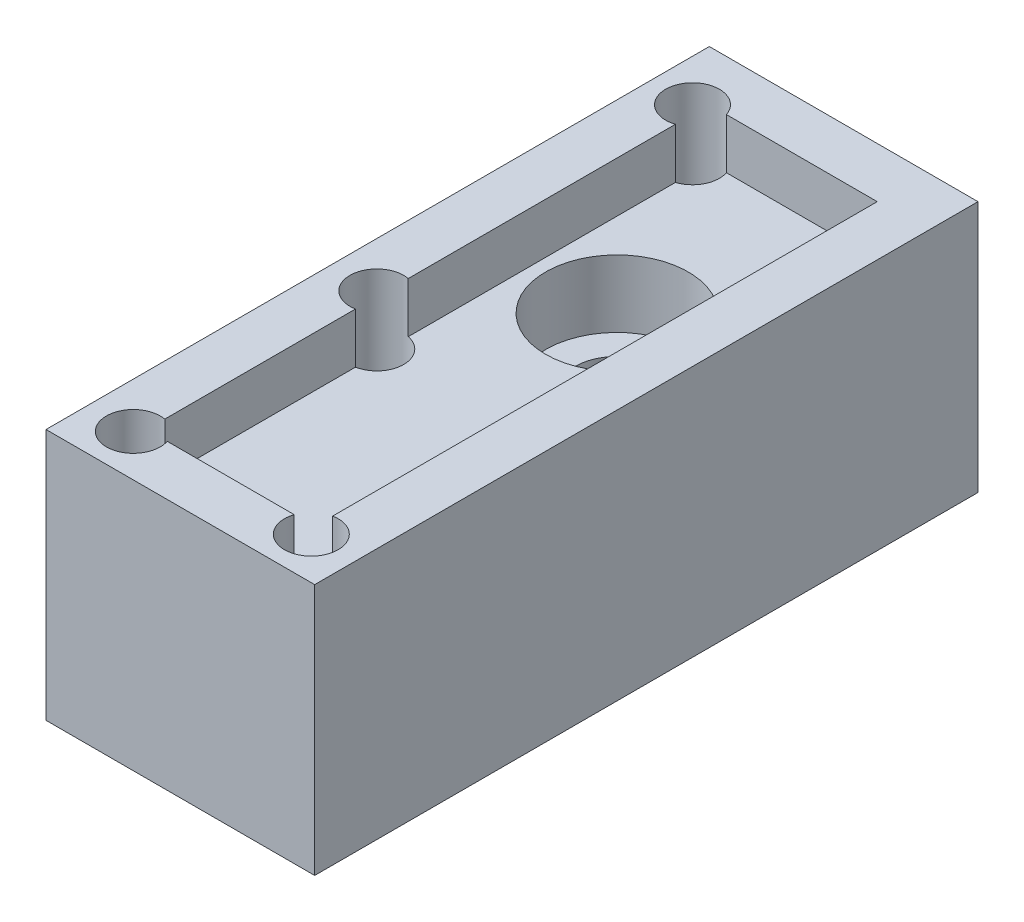
ISO-10303-21;
HEADER;
FILE_DESCRIPTION(('STEP AP214'),'2;1');
FILE_NAME('part.step','',(''),(''),'','','');
FILE_SCHEMA(('AUTOMOTIVE_DESIGN { 1 0 10303 214 1 1 1 1 }'));
ENDSEC;
DATA;
#1=APPLICATION_CONTEXT('core data for automotive mechanical design processes');
#2=APPLICATION_PROTOCOL_DEFINITION('international standard','automotive_design',2000,#1);
#3=PRODUCT_CONTEXT('',#1,'mechanical');
#4=PRODUCT('Part','Part','',(#3));
#5=PRODUCT_RELATED_PRODUCT_CATEGORY('part','',(#4));
#6=PRODUCT_DEFINITION_FORMATION('','',#4);
#7=PRODUCT_DEFINITION_CONTEXT('part definition',#1,'design');
#8=PRODUCT_DEFINITION('design','',#6,#7);
#9=PRODUCT_DEFINITION_SHAPE('','',#8);
#10=(LENGTH_UNIT() NAMED_UNIT(*) SI_UNIT(.MILLI.,.METRE.));
#11=(NAMED_UNIT(*) PLANE_ANGLE_UNIT() SI_UNIT($,.RADIAN.));
#12=(NAMED_UNIT(*) SI_UNIT($,.STERADIAN.) SOLID_ANGLE_UNIT());
#13=UNCERTAINTY_MEASURE_WITH_UNIT(LENGTH_MEASURE(1.E-05),#10,'distance_accuracy_value','');
#14=(GEOMETRIC_REPRESENTATION_CONTEXT(3) GLOBAL_UNCERTAINTY_ASSIGNED_CONTEXT((#13)) GLOBAL_UNIT_ASSIGNED_CONTEXT((#10,
#11,#12)) REPRESENTATION_CONTEXT('',''));
#15=CARTESIAN_POINT('',(0.,0.,0.));
#16=DIRECTION('',(0.,0.,1.));
#17=DIRECTION('',(1.,0.,0.));
#18=AXIS2_PLACEMENT_3D('',#15,#16,#17);
#19=CARTESIAN_POINT('',(8.,-8.,-26.));
#20=DIRECTION('',(0.,1.,0.));
#21=DIRECTION('',(0.,0.,1.));
#22=AXIS2_PLACEMENT_3D('',#19,#20,#21);
#23=CYLINDRICAL_SURFACE('',#22,2.5);
#24=CARTESIAN_POINT('',(8.,0.,-26.));
#25=DIRECTION('',(0.,-1.,0.));
#26=DIRECTION('',(0.,0.,-1.));
#27=AXIS2_PLACEMENT_3D('',#24,#25,#26);
#28=CIRCLE('',#27,2.5);
#29=CARTESIAN_POINT('',(8.,0.,-28.5));
#30=VERTEX_POINT('',#29);
#31=EDGE_CURVE('E243',#30,#30,#28,.T.);
#32=ORIENTED_EDGE('',*,*,#31,.T.);
#33=EDGE_LOOP('',(#32));
#34=FACE_BOUND('',#33,.T.);
#35=CARTESIAN_POINT('',(8.,8.,-26.));
#36=DIRECTION('',(0.,1.,0.));
#37=DIRECTION('',(0.,0.,1.));
#38=AXIS2_PLACEMENT_3D('',#35,#36,#37);
#39=CIRCLE('',#38,2.5);
#40=CARTESIAN_POINT('',(8.,8.,-23.5));
#41=VERTEX_POINT('',#40);
#42=EDGE_CURVE('E37',#41,#41,#39,.F.);
#43=ORIENTED_EDGE('',*,*,#42,.F.);
#44=EDGE_LOOP('',(#43));
#45=FACE_BOUND('',#44,.T.);
#46=ADVANCED_FACE('F33',(#34,#45),#23,.F.);
#47=CARTESIAN_POINT('',(3.,12.,-3.));
#48=DIRECTION('',(-1.,0.,0.));
#49=DIRECTION('',(0.,0.,1.));
#50=AXIS2_PLACEMENT_3D('',#47,#48,#49);
#51=PLANE('',#50);
#52=DIRECTION('',(0.,-1.,0.));
#53=VECTOR('',#52,1.);
#54=CARTESIAN_POINT('',(3.,18.,-18.5716233645502));
#55=LINE('',#54,#53);
#56=CARTESIAN_POINT('',(3.,12.,-18.5716233645502));
#57=VERTEX_POINT('',#56);
#58=CARTESIAN_POINT('',(3.,15.,-18.5716233645502));
#59=VERTEX_POINT('',#58);
#60=EDGE_CURVE('E206',#57,#59,#55,.F.);
#61=ORIENTED_EDGE('',*,*,#60,.F.);
#62=DIRECTION('',(0.,0.,1.));
#63=VECTOR('',#62,1.);
#64=CARTESIAN_POINT('',(3.,12.,-3.));
#65=LINE('',#64,#63);
#66=CARTESIAN_POINT('',(3.,12.,-34.4801315846429));
#67=VERTEX_POINT('',#66);
#68=EDGE_CURVE('E212',#67,#57,#65,.T.);
#69=ORIENTED_EDGE('',*,*,#68,.F.);
#70=DIRECTION('',(0.,-1.,0.));
#71=VECTOR('',#70,1.);
#72=CARTESIAN_POINT('',(3.,18.,-34.4801315846429));
#73=LINE('',#72,#71);
#74=CARTESIAN_POINT('',(3.,15.,-34.4801315846429));
#75=VERTEX_POINT('',#74);
#76=EDGE_CURVE('E133',#75,#67,#73,.T.);
#77=ORIENTED_EDGE('',*,*,#76,.F.);
#78=DIRECTION('',(0.,0.,1.));
#79=VECTOR('',#78,1.);
#80=CARTESIAN_POINT('',(3.,15.,-3.));
#81=LINE('',#80,#79);
#82=EDGE_CURVE('E164',#75,#59,#81,.T.);
#83=ORIENTED_EDGE('',*,*,#82,.T.);
#84=EDGE_LOOP('',(#61,#69,#77,#83));
#85=FACE_BOUND('',#84,.T.);
#86=ADVANCED_FACE('F211',(#85),#51,.F.);
#87=DIRECTION('',(0.,-1.,0.));
#88=VECTOR('',#87,1.);
#89=CARTESIAN_POINT('',(3.,18.,-15.4283766354498));
#90=LINE('',#89,#88);
#91=CARTESIAN_POINT('',(3.,15.,-15.4283766354498));
#92=VERTEX_POINT('',#91);
#93=CARTESIAN_POINT('',(3.,12.,-15.4283766354498));
#94=VERTEX_POINT('',#93);
#95=EDGE_CURVE('E56',#92,#94,#90,.T.);
#96=ORIENTED_EDGE('',*,*,#95,.F.);
#97=CARTESIAN_POINT('',(3.,15.,-4.07162336455017));
#98=VERTEX_POINT('',#97);
#99=EDGE_CURVE('E162',#92,#98,#81,.T.);
#100=ORIENTED_EDGE('',*,*,#99,.T.);
#101=DIRECTION('',(0.,1.,0.));
#102=VECTOR('',#101,1.);
#103=CARTESIAN_POINT('',(3.,0.,-4.07162336455017));
#104=LINE('',#103,#102);
#105=CARTESIAN_POINT('',(3.,12.,-4.07162336455017));
#106=VERTEX_POINT('',#105);
#107=EDGE_CURVE('E165',#98,#106,#104,.F.);
#108=ORIENTED_EDGE('',*,*,#107,.T.);
#109=EDGE_CURVE('E171',#94,#106,#65,.T.);
#110=ORIENTED_EDGE('',*,*,#109,.F.);
#111=EDGE_LOOP('',(#96,#100,#108,#110));
#112=FACE_BOUND('',#111,.T.);
#113=ADVANCED_FACE('F270',(#112),#51,.F.);
#114=CARTESIAN_POINT('',(3.,12.,-36.5));
#115=DIRECTION('',(0.,0.,-1.));
#116=DIRECTION('',(-1.,0.,0.));
#117=AXIS2_PLACEMENT_3D('',#114,#115,#116);
#118=PLANE('',#117);
#119=DIRECTION('',(0.,-1.,0.));
#120=VECTOR('',#119,1.);
#121=CARTESIAN_POINT('',(4.01986841535706,18.,-36.5));
#122=LINE('',#121,#120);
#123=CARTESIAN_POINT('',(4.01986841535706,12.,-36.5));
#124=VERTEX_POINT('',#123);
#125=CARTESIAN_POINT('',(4.01986841535706,15.,-36.5));
#126=VERTEX_POINT('',#125);
#127=EDGE_CURVE('E130',#124,#126,#122,.F.);
#128=ORIENTED_EDGE('',*,*,#127,.F.);
#129=DIRECTION('',(-1.,0.,0.));
#130=VECTOR('',#129,1.);
#131=CARTESIAN_POINT('',(3.,12.,-36.5));
#132=LINE('',#131,#130);
#133=CARTESIAN_POINT('',(13.,12.,-36.5));
#134=VERTEX_POINT('',#133);
#135=EDGE_CURVE('E145',#134,#124,#132,.T.);
#136=ORIENTED_EDGE('',*,*,#135,.F.);
#137=DIRECTION('',(0.,1.,0.));
#138=VECTOR('',#137,1.);
#139=CARTESIAN_POINT('',(13.,12.,-36.5));
#140=LINE('',#139,#138);
#141=CARTESIAN_POINT('',(13.,15.,-36.5));
#142=VERTEX_POINT('',#141);
#143=EDGE_CURVE('E154',#134,#142,#140,.T.);
#144=ORIENTED_EDGE('',*,*,#143,.T.);
#145=DIRECTION('',(-1.,0.,0.));
#146=VECTOR('',#145,1.);
#147=CARTESIAN_POINT('',(3.,15.,-36.5));
#148=LINE('',#147,#146);
#149=EDGE_CURVE('E147',#142,#126,#148,.T.);
#150=ORIENTED_EDGE('',*,*,#149,.T.);
#151=EDGE_LOOP('',(#128,#136,#144,#150));
#152=FACE_BOUND('',#151,.T.);
#153=ADVANCED_FACE('F143',(#152),#118,.F.);
#154=CARTESIAN_POINT('',(13.,12.,-3.));
#155=DIRECTION('',(1.,0.,0.));
#156=DIRECTION('',(0.,0.,-1.));
#157=AXIS2_PLACEMENT_3D('',#154,#155,#156);
#158=PLANE('',#157);
#159=DIRECTION('',(0.,-1.,0.));
#160=VECTOR('',#159,1.);
#161=CARTESIAN_POINT('',(13.,18.,-4.07162336455017));
#162=LINE('',#161,#160);
#163=CARTESIAN_POINT('',(13.,15.,-4.07162336455017));
#164=VERTEX_POINT('',#163);
#165=CARTESIAN_POINT('',(13.,12.,-4.07162336455017));
#166=VERTEX_POINT('',#165);
#167=EDGE_CURVE('E48',#164,#166,#162,.T.);
#168=ORIENTED_EDGE('',*,*,#167,.F.);
#169=DIRECTION('',(0.,0.,-1.));
#170=VECTOR('',#169,1.);
#171=CARTESIAN_POINT('',(13.,15.,-3.));
#172=LINE('',#171,#170);
#173=EDGE_CURVE('E169',#164,#142,#172,.T.);
#174=ORIENTED_EDGE('',*,*,#173,.T.);
#175=ORIENTED_EDGE('',*,*,#143,.F.);
#176=DIRECTION('',(0.,0.,-1.));
#177=VECTOR('',#176,1.);
#178=CARTESIAN_POINT('',(13.,12.,-3.));
#179=LINE('',#178,#177);
#180=EDGE_CURVE('E152',#166,#134,#179,.T.);
#181=ORIENTED_EDGE('',*,*,#180,.F.);
#182=EDGE_LOOP('',(#168,#174,#175,#181));
#183=FACE_BOUND('',#182,.T.);
#184=ADVANCED_FACE('F295',(#183),#158,.F.);
#185=CARTESIAN_POINT('',(3.,12.,-3.));
#186=DIRECTION('',(0.,0.,1.));
#187=DIRECTION('',(1.,0.,0.));
#188=AXIS2_PLACEMENT_3D('',#185,#186,#187);
#189=PLANE('',#188);
#190=DIRECTION('',(0.,-1.,0.));
#191=VECTOR('',#190,1.);
#192=CARTESIAN_POINT('',(11.7801315846429,18.,-3.));
#193=LINE('',#192,#191);
#194=CARTESIAN_POINT('',(11.7801315846429,12.,-3.));
#195=VERTEX_POINT('',#194);
#196=CARTESIAN_POINT('',(11.7801315846429,15.,-3.));
#197=VERTEX_POINT('',#196);
#198=EDGE_CURVE('E232',#195,#197,#193,.F.);
#199=ORIENTED_EDGE('',*,*,#198,.F.);
#200=DIRECTION('',(1.,0.,0.));
#201=VECTOR('',#200,1.);
#202=CARTESIAN_POINT('',(3.,12.,-3.));
#203=LINE('',#202,#201);
#204=CARTESIAN_POINT('',(4.21986841535707,12.,-3.));
#205=VERTEX_POINT('',#204);
#206=EDGE_CURVE('E158',#205,#195,#203,.T.);
#207=ORIENTED_EDGE('',*,*,#206,.F.);
#208=DIRECTION('',(0.,1.,0.));
#209=VECTOR('',#208,1.);
#210=CARTESIAN_POINT('',(4.21986841535707,0.,-3.));
#211=LINE('',#210,#209);
#212=CARTESIAN_POINT('',(4.21986841535707,15.,-3.));
#213=VERTEX_POINT('',#212);
#214=EDGE_CURVE('E221',#205,#213,#211,.T.);
#215=ORIENTED_EDGE('',*,*,#214,.T.);
#216=DIRECTION('',(1.,0.,0.));
#217=VECTOR('',#216,1.);
#218=CARTESIAN_POINT('',(3.,15.,-3.));
#219=LINE('',#218,#217);
#220=EDGE_CURVE('E166',#213,#197,#219,.T.);
#221=ORIENTED_EDGE('',*,*,#220,.T.);
#222=EDGE_LOOP('',(#199,#207,#215,#221));
#223=FACE_BOUND('',#222,.T.);
#224=ADVANCED_FACE('F298',(#223),#189,.F.);
#225=CARTESIAN_POINT('',(0.,15.,0.));
#226=DIRECTION('',(1.,0.,0.));
#227=DIRECTION('',(0.,0.,-1.));
#228=AXIS2_PLACEMENT_3D('',#225,#226,#227);
#229=PLANE('',#228);
#230=DIRECTION('',(0.,0.,1.));
#231=VECTOR('',#230,1.);
#232=CARTESIAN_POINT('',(0.,0.,0.));
#233=LINE('',#232,#231);
#234=CARTESIAN_POINT('',(0.,0.,-39.5));
#235=VERTEX_POINT('',#234);
#236=CARTESIAN_POINT('',(0.,0.,0.));
#237=VERTEX_POINT('',#236);
#238=EDGE_CURVE('E156',#235,#237,#233,.T.);
#239=ORIENTED_EDGE('',*,*,#238,.T.);
#240=DIRECTION('',(0.,-1.,0.));
#241=VECTOR('',#240,1.);
#242=CARTESIAN_POINT('',(0.,15.,0.));
#243=LINE('',#242,#241);
#244=CARTESIAN_POINT('',(0.,15.,0.));
#245=VERTEX_POINT('',#244);
#246=EDGE_CURVE('E199',#245,#237,#243,.T.);
#247=ORIENTED_EDGE('',*,*,#246,.F.);
#248=DIRECTION('',(0.,0.,1.));
#249=VECTOR('',#248,1.);
#250=CARTESIAN_POINT('',(0.,15.,0.));
#251=LINE('',#250,#249);
#252=CARTESIAN_POINT('',(0.,15.,-39.5));
#253=VERTEX_POINT('',#252);
#254=EDGE_CURVE('E173',#253,#245,#251,.T.);
#255=ORIENTED_EDGE('',*,*,#254,.F.);
#256=DIRECTION('',(0.,-1.,0.));
#257=VECTOR('',#256,1.);
#258=CARTESIAN_POINT('',(0.,15.,-39.5));
#259=LINE('',#258,#257);
#260=EDGE_CURVE('E183',#253,#235,#259,.T.);
#261=ORIENTED_EDGE('',*,*,#260,.T.);
#262=EDGE_LOOP('',(#239,#247,#255,#261));
#263=FACE_BOUND('',#262,.T.);
#264=ADVANCED_FACE('F35',(#263),#229,.F.);
#265=CARTESIAN_POINT('',(0.,15.,0.));
#266=DIRECTION('',(0.,0.,-1.));
#267=DIRECTION('',(-1.,0.,0.));
#268=AXIS2_PLACEMENT_3D('',#265,#266,#267);
#269=PLANE('',#268);
#270=DIRECTION('',(1.,0.,0.));
#271=VECTOR('',#270,1.);
#272=CARTESIAN_POINT('',(0.,0.,0.));
#273=LINE('',#272,#271);
#274=CARTESIAN_POINT('',(16.,0.,0.));
#275=VERTEX_POINT('',#274);
#276=EDGE_CURVE('E186',#237,#275,#273,.T.);
#277=ORIENTED_EDGE('',*,*,#276,.T.);
#278=DIRECTION('',(0.,-1.,0.));
#279=VECTOR('',#278,1.);
#280=CARTESIAN_POINT('',(16.,15.,0.));
#281=LINE('',#280,#279);
#282=CARTESIAN_POINT('',(16.,15.,0.));
#283=VERTEX_POINT('',#282);
#284=EDGE_CURVE('E196',#283,#275,#281,.T.);
#285=ORIENTED_EDGE('',*,*,#284,.F.);
#286=DIRECTION('',(1.,0.,0.));
#287=VECTOR('',#286,1.);
#288=CARTESIAN_POINT('',(0.,15.,0.));
#289=LINE('',#288,#287);
#290=EDGE_CURVE('E176',#245,#283,#289,.T.);
#291=ORIENTED_EDGE('',*,*,#290,.F.);
#292=ORIENTED_EDGE('',*,*,#246,.T.);
#293=EDGE_LOOP('',(#277,#285,#291,#292));
#294=FACE_BOUND('',#293,.T.);
#295=ADVANCED_FACE('F316',(#294),#269,.F.);
#296=CARTESIAN_POINT('',(16.,15.,0.));
#297=DIRECTION('',(-1.,0.,0.));
#298=DIRECTION('',(0.,0.,1.));
#299=AXIS2_PLACEMENT_3D('',#296,#297,#298);
#300=PLANE('',#299);
#301=DIRECTION('',(0.,0.,-1.));
#302=VECTOR('',#301,1.);
#303=CARTESIAN_POINT('',(16.,0.,0.));
#304=LINE('',#303,#302);
#305=CARTESIAN_POINT('',(16.,0.,-39.5));
#306=VERTEX_POINT('',#305);
#307=EDGE_CURVE('E188',#275,#306,#304,.T.);
#308=ORIENTED_EDGE('',*,*,#307,.T.);
#309=DIRECTION('',(0.,-1.,0.));
#310=VECTOR('',#309,1.);
#311=CARTESIAN_POINT('',(16.,15.,-39.5));
#312=LINE('',#311,#310);
#313=CARTESIAN_POINT('',(16.,15.,-39.5));
#314=VERTEX_POINT('',#313);
#315=EDGE_CURVE('E193',#314,#306,#312,.T.);
#316=ORIENTED_EDGE('',*,*,#315,.F.);
#317=DIRECTION('',(0.,0.,-1.));
#318=VECTOR('',#317,1.);
#319=CARTESIAN_POINT('',(16.,15.,0.));
#320=LINE('',#319,#318);
#321=EDGE_CURVE('E179',#283,#314,#320,.T.);
#322=ORIENTED_EDGE('',*,*,#321,.F.);
#323=ORIENTED_EDGE('',*,*,#284,.T.);
#324=EDGE_LOOP('',(#308,#316,#322,#323));
#325=FACE_BOUND('',#324,.T.);
#326=ADVANCED_FACE('F313',(#325),#300,.F.);
#327=CARTESIAN_POINT('',(0.,15.,-39.5));
#328=DIRECTION('',(0.,0.,1.));
#329=DIRECTION('',(1.,0.,0.));
#330=AXIS2_PLACEMENT_3D('',#327,#328,#329);
#331=PLANE('',#330);
#332=DIRECTION('',(-1.,0.,0.));
#333=VECTOR('',#332,1.);
#334=CARTESIAN_POINT('',(0.,0.,-39.5));
#335=LINE('',#334,#333);
#336=EDGE_CURVE('E177',#306,#235,#335,.T.);
#337=ORIENTED_EDGE('',*,*,#336,.T.);
#338=ORIENTED_EDGE('',*,*,#260,.F.);
#339=DIRECTION('',(-1.,0.,0.));
#340=VECTOR('',#339,1.);
#341=CARTESIAN_POINT('',(0.,15.,-39.5));
#342=LINE('',#341,#340);
#343=EDGE_CURVE('E181',#314,#253,#342,.T.);
#344=ORIENTED_EDGE('',*,*,#343,.F.);
#345=ORIENTED_EDGE('',*,*,#315,.T.);
#346=EDGE_LOOP('',(#337,#338,#344,#345));
#347=FACE_BOUND('',#346,.T.);
#348=ADVANCED_FACE('F306',(#347),#331,.F.);
#349=CARTESIAN_POINT('',(0.,15.,0.));
#350=DIRECTION('',(0.,-1.,0.));
#351=DIRECTION('',(0.,0.,-1.));
#352=AXIS2_PLACEMENT_3D('',#349,#350,#351);
#353=PLANE('',#352);
#354=CARTESIAN_POINT('',(13.3,15.,-2.5));
#355=DIRECTION('',(0.,-1.,0.));
#356=DIRECTION('',(0.,0.,-1.));
#357=AXIS2_PLACEMENT_3D('',#354,#355,#356);
#358=CIRCLE('',#357,1.6);
#359=EDGE_CURVE('E229',#197,#164,#358,.F.);
#360=ORIENTED_EDGE('',*,*,#359,.F.);
#361=ORIENTED_EDGE('',*,*,#220,.F.);
#362=CARTESIAN_POINT('',(2.7,15.,-2.5));
#363=DIRECTION('',(0.,1.,0.));
#364=DIRECTION('',(0.,0.,1.));
#365=AXIS2_PLACEMENT_3D('',#362,#363,#364);
#366=CIRCLE('',#365,1.6);
#367=EDGE_CURVE('E227',#98,#213,#366,.T.);
#368=ORIENTED_EDGE('',*,*,#367,.F.);
#369=ORIENTED_EDGE('',*,*,#99,.F.);
#370=CARTESIAN_POINT('',(2.7,15.,-17.));
#371=DIRECTION('',(0.,-1.,0.));
#372=DIRECTION('',(0.,0.,-1.));
#373=AXIS2_PLACEMENT_3D('',#370,#371,#372);
#374=CIRCLE('',#373,1.6);
#375=EDGE_CURVE('E214',#59,#92,#374,.F.);
#376=ORIENTED_EDGE('',*,*,#375,.F.);
#377=ORIENTED_EDGE('',*,*,#82,.F.);
#378=CARTESIAN_POINT('',(2.5,15.,-36.));
#379=DIRECTION('',(0.,-1.,0.));
#380=DIRECTION('',(0.,0.,-1.));
#381=AXIS2_PLACEMENT_3D('',#378,#379,#380);
#382=CIRCLE('',#381,1.6);
#383=EDGE_CURVE('E236',#126,#75,#382,.F.);
#384=ORIENTED_EDGE('',*,*,#383,.F.);
#385=ORIENTED_EDGE('',*,*,#149,.F.);
#386=ORIENTED_EDGE('',*,*,#173,.F.);
#387=EDGE_LOOP('',(#360,#361,#368,#369,#376,#377,#384,#385,#386));
#388=FACE_BOUND('',#387,.T.);
#389=ORIENTED_EDGE('',*,*,#254,.T.);
#390=ORIENTED_EDGE('',*,*,#290,.T.);
#391=ORIENTED_EDGE('',*,*,#321,.T.);
#392=ORIENTED_EDGE('',*,*,#343,.T.);
#393=EDGE_LOOP('',(#389,#390,#391,#392));
#394=FACE_BOUND('',#393,.T.);
#395=ADVANCED_FACE('F303',(#388,#394),#353,.F.);
#396=CARTESIAN_POINT('',(0.,0.,0.));
#397=DIRECTION('',(0.,-1.,0.));
#398=DIRECTION('',(0.,0.,-1.));
#399=AXIS2_PLACEMENT_3D('',#396,#397,#398);
#400=PLANE('',#399);
#401=ORIENTED_EDGE('',*,*,#31,.F.);
#402=EDGE_LOOP('',(#401));
#403=FACE_BOUND('',#402,.T.);
#404=CARTESIAN_POINT('',(13.3,0.,-2.5));
#405=DIRECTION('',(0.,1.,0.));
#406=DIRECTION('',(0.,0.,1.));
#407=AXIS2_PLACEMENT_3D('',#404,#405,#406);
#408=CIRCLE('',#407,1.6);
#409=CARTESIAN_POINT('',(13.3,0.,-0.899999999999998));
#410=VERTEX_POINT('',#409);
#411=EDGE_CURVE('E148',#410,#410,#408,.T.);
#412=ORIENTED_EDGE('',*,*,#411,.T.);
#413=EDGE_LOOP('',(#412));
#414=FACE_BOUND('',#413,.T.);
#415=CARTESIAN_POINT('',(2.7,0.,-17.));
#416=DIRECTION('',(0.,1.,0.));
#417=DIRECTION('',(0.,0.,1.));
#418=AXIS2_PLACEMENT_3D('',#415,#416,#417);
#419=CIRCLE('',#418,1.6);
#420=CARTESIAN_POINT('',(2.7,0.,-15.4));
#421=VERTEX_POINT('',#420);
#422=EDGE_CURVE('E242',#421,#421,#419,.T.);
#423=ORIENTED_EDGE('',*,*,#422,.T.);
#424=EDGE_LOOP('',(#423));
#425=FACE_BOUND('',#424,.T.);
#426=CARTESIAN_POINT('',(2.5,0.,-36.));
#427=DIRECTION('',(0.,1.,0.));
#428=DIRECTION('',(0.,0.,1.));
#429=AXIS2_PLACEMENT_3D('',#426,#427,#428);
#430=CIRCLE('',#429,1.6);
#431=CARTESIAN_POINT('',(2.5,0.,-34.4));
#432=VERTEX_POINT('',#431);
#433=EDGE_CURVE('E239',#432,#432,#430,.T.);
#434=ORIENTED_EDGE('',*,*,#433,.T.);
#435=EDGE_LOOP('',(#434));
#436=FACE_BOUND('',#435,.T.);
#437=CARTESIAN_POINT('',(2.7,0.,-2.5));
#438=DIRECTION('',(0.,1.,0.));
#439=DIRECTION('',(0.,0.,1.));
#440=AXIS2_PLACEMENT_3D('',#437,#438,#439);
#441=CIRCLE('',#440,1.6);
#442=CARTESIAN_POINT('',(2.7,0.,-0.9));
#443=VERTEX_POINT('',#442);
#444=EDGE_CURVE('E224',#443,#443,#441,.T.);
#445=ORIENTED_EDGE('',*,*,#444,.T.);
#446=EDGE_LOOP('',(#445));
#447=FACE_BOUND('',#446,.T.);
#448=ORIENTED_EDGE('',*,*,#238,.F.);
#449=ORIENTED_EDGE('',*,*,#336,.F.);
#450=ORIENTED_EDGE('',*,*,#307,.F.);
#451=ORIENTED_EDGE('',*,*,#276,.F.);
#452=EDGE_LOOP('',(#448,#449,#450,#451));
#453=FACE_BOUND('',#452,.T.);
#454=ADVANCED_FACE('F291',(#403,#414,#425,#436,#447,#453),#400,.T.);
#455=CARTESIAN_POINT('',(0.,12.,0.));
#456=DIRECTION('',(0.,-1.,0.));
#457=DIRECTION('',(0.,0.,-1.));
#458=AXIS2_PLACEMENT_3D('',#455,#456,#457);
#459=PLANE('',#458);
#460=CARTESIAN_POINT('',(8.,12.,-26.));
#461=DIRECTION('',(0.,1.,0.));
#462=DIRECTION('',(0.,0.,1.));
#463=AXIS2_PLACEMENT_3D('',#460,#461,#462);
#464=CIRCLE('',#463,4.25);
#465=CARTESIAN_POINT('',(8.,12.,-21.75));
#466=VERTEX_POINT('',#465);
#467=EDGE_CURVE('E250',#466,#466,#464,.T.);
#468=ORIENTED_EDGE('',*,*,#467,.F.);
#469=EDGE_LOOP('',(#468));
#470=FACE_BOUND('',#469,.T.);
#471=CARTESIAN_POINT('',(13.3,12.,-2.5));
#472=DIRECTION('',(0.,-1.,0.));
#473=DIRECTION('',(0.,0.,-1.));
#474=AXIS2_PLACEMENT_3D('',#471,#472,#473);
#475=CIRCLE('',#474,1.6);
#476=EDGE_CURVE('E11',#166,#195,#475,.F.);
#477=ORIENTED_EDGE('',*,*,#476,.F.);
#478=ORIENTED_EDGE('',*,*,#180,.T.);
#479=ORIENTED_EDGE('',*,*,#135,.T.);
#480=CARTESIAN_POINT('',(2.5,12.,-36.));
#481=DIRECTION('',(0.,-1.,0.));
#482=DIRECTION('',(0.,0.,-1.));
#483=AXIS2_PLACEMENT_3D('',#480,#481,#482);
#484=CIRCLE('',#483,1.6);
#485=EDGE_CURVE('E127',#67,#124,#484,.F.);
#486=ORIENTED_EDGE('',*,*,#485,.F.);
#487=ORIENTED_EDGE('',*,*,#68,.T.);
#488=CARTESIAN_POINT('',(2.7,12.,-17.));
#489=DIRECTION('',(0.,-1.,0.));
#490=DIRECTION('',(0.,0.,-1.));
#491=AXIS2_PLACEMENT_3D('',#488,#489,#490);
#492=CIRCLE('',#491,1.6);
#493=EDGE_CURVE('E42',#94,#57,#492,.F.);
#494=ORIENTED_EDGE('',*,*,#493,.F.);
#495=ORIENTED_EDGE('',*,*,#109,.T.);
#496=CARTESIAN_POINT('',(2.7,12.,-2.5));
#497=DIRECTION('',(0.,-1.,0.));
#498=DIRECTION('',(0.,0.,-1.));
#499=AXIS2_PLACEMENT_3D('',#496,#497,#498);
#500=CIRCLE('',#499,1.6);
#501=EDGE_CURVE('E138',#106,#205,#500,.T.);
#502=ORIENTED_EDGE('',*,*,#501,.T.);
#503=ORIENTED_EDGE('',*,*,#206,.T.);
#504=EDGE_LOOP('',(#477,#478,#479,#486,#487,#494,#495,#502,#503));
#505=FACE_BOUND('',#504,.T.);
#506=ADVANCED_FACE('F150',(#470,#505),#459,.F.);
#507=CARTESIAN_POINT('',(2.7,0.,-2.5));
#508=DIRECTION('',(0.,1.,0.));
#509=DIRECTION('',(0.,0.,1.));
#510=AXIS2_PLACEMENT_3D('',#507,#508,#509);
#511=CYLINDRICAL_SURFACE('',#510,1.6);
#512=ORIENTED_EDGE('',*,*,#444,.F.);
#513=EDGE_LOOP('',(#512));
#514=FACE_BOUND('',#513,.T.);
#515=ORIENTED_EDGE('',*,*,#367,.T.);
#516=ORIENTED_EDGE('',*,*,#214,.F.);
#517=ORIENTED_EDGE('',*,*,#501,.F.);
#518=ORIENTED_EDGE('',*,*,#107,.F.);
#519=EDGE_LOOP('',(#515,#516,#517,#518));
#520=FACE_BOUND('',#519,.T.);
#521=ADVANCED_FACE('F284',(#514,#520),#511,.F.);
#522=CARTESIAN_POINT('',(2.5,18.,-36.));
#523=DIRECTION('',(0.,-1.,0.));
#524=DIRECTION('',(0.,0.,-1.));
#525=AXIS2_PLACEMENT_3D('',#522,#523,#524);
#526=CYLINDRICAL_SURFACE('',#525,1.6);
#527=ORIENTED_EDGE('',*,*,#433,.F.);
#528=EDGE_LOOP('',(#527));
#529=FACE_BOUND('',#528,.T.);
#530=ORIENTED_EDGE('',*,*,#383,.T.);
#531=ORIENTED_EDGE('',*,*,#76,.T.);
#532=ORIENTED_EDGE('',*,*,#485,.T.);
#533=ORIENTED_EDGE('',*,*,#127,.T.);
#534=EDGE_LOOP('',(#530,#531,#532,#533));
#535=FACE_BOUND('',#534,.T.);
#536=ADVANCED_FACE('F129',(#529,#535),#526,.F.);
#537=CARTESIAN_POINT('',(2.7,18.,-17.));
#538=DIRECTION('',(0.,-1.,0.));
#539=DIRECTION('',(0.,0.,-1.));
#540=AXIS2_PLACEMENT_3D('',#537,#538,#539);
#541=CYLINDRICAL_SURFACE('',#540,1.6);
#542=ORIENTED_EDGE('',*,*,#422,.F.);
#543=EDGE_LOOP('',(#542));
#544=FACE_BOUND('',#543,.T.);
#545=ORIENTED_EDGE('',*,*,#375,.T.);
#546=ORIENTED_EDGE('',*,*,#95,.T.);
#547=ORIENTED_EDGE('',*,*,#493,.T.);
#548=ORIENTED_EDGE('',*,*,#60,.T.);
#549=EDGE_LOOP('',(#545,#546,#547,#548));
#550=FACE_BOUND('',#549,.T.);
#551=ADVANCED_FACE('F205',(#544,#550),#541,.F.);
#552=CARTESIAN_POINT('',(13.3,18.,-2.5));
#553=DIRECTION('',(0.,-1.,0.));
#554=DIRECTION('',(0.,0.,-1.));
#555=AXIS2_PLACEMENT_3D('',#552,#553,#554);
#556=CYLINDRICAL_SURFACE('',#555,1.6);
#557=ORIENTED_EDGE('',*,*,#411,.F.);
#558=EDGE_LOOP('',(#557));
#559=FACE_BOUND('',#558,.T.);
#560=ORIENTED_EDGE('',*,*,#359,.T.);
#561=ORIENTED_EDGE('',*,*,#167,.T.);
#562=ORIENTED_EDGE('',*,*,#476,.T.);
#563=ORIENTED_EDGE('',*,*,#198,.T.);
#564=EDGE_LOOP('',(#560,#561,#562,#563));
#565=FACE_BOUND('',#564,.T.);
#566=ADVANCED_FACE('F276',(#559,#565),#556,.F.);
#567=CARTESIAN_POINT('',(8.,8.,-26.));
#568=DIRECTION('',(0.,1.,0.));
#569=DIRECTION('',(0.,0.,1.));
#570=AXIS2_PLACEMENT_3D('',#567,#568,#569);
#571=PLANE('',#570);
#572=CARTESIAN_POINT('',(8.,8.,-26.));
#573=DIRECTION('',(0.,1.,0.));
#574=DIRECTION('',(0.,0.,1.));
#575=AXIS2_PLACEMENT_3D('',#572,#573,#574);
#576=CIRCLE('',#575,4.25);
#577=CARTESIAN_POINT('',(8.,8.,-21.75));
#578=VERTEX_POINT('',#577);
#579=EDGE_CURVE('E253',#578,#578,#576,.T.);
#580=ORIENTED_EDGE('',*,*,#579,.T.);
#581=EDGE_LOOP('',(#580));
#582=FACE_BOUND('',#581,.T.);
#583=ORIENTED_EDGE('',*,*,#42,.T.);
#584=EDGE_LOOP('',(#583));
#585=FACE_BOUND('',#584,.T.);
#586=ADVANCED_FACE('F260',(#582,#585),#571,.T.);
#587=CARTESIAN_POINT('',(8.,8.,-26.));
#588=DIRECTION('',(0.,1.,0.));
#589=DIRECTION('',(0.,0.,1.));
#590=AXIS2_PLACEMENT_3D('',#587,#588,#589);
#591=CYLINDRICAL_SURFACE('',#590,4.25);
#592=ORIENTED_EDGE('',*,*,#579,.F.);
#593=EDGE_LOOP('',(#592));
#594=FACE_BOUND('',#593,.T.);
#595=ORIENTED_EDGE('',*,*,#467,.T.);
#596=EDGE_LOOP('',(#595));
#597=FACE_BOUND('',#596,.T.);
#598=ADVANCED_FACE('F274',(#594,#597),#591,.F.);
#599=CLOSED_SHELL('',(#46,#86,#113,#153,#184,#224,#264,#295,#326,#348,#395,#454,#506,#521,#536,
#551,#566,#586,#598));
#600=MANIFOLD_SOLID_BREP('B2',#599);
#601=ADVANCED_BREP_SHAPE_REPRESENTATION('',(#18,#600),#14);
#602=SHAPE_DEFINITION_REPRESENTATION(#9,#601);
ENDSEC;
END-ISO-10303-21;
